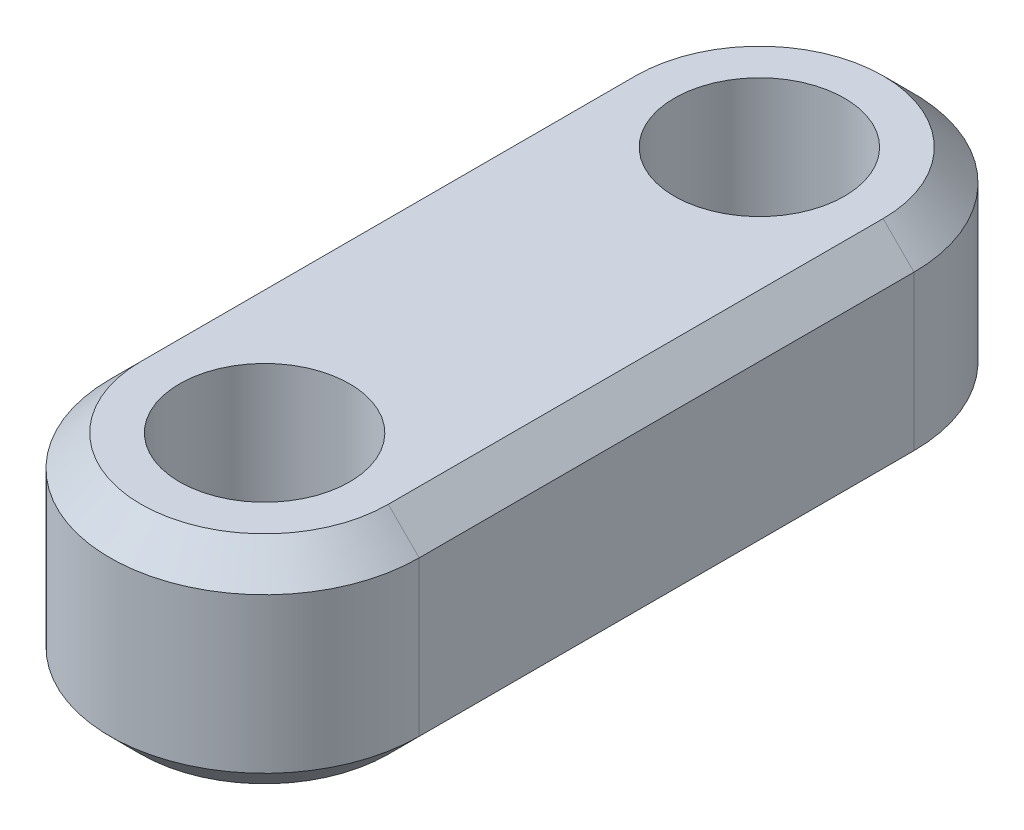
ISO-10303-21;
HEADER;
FILE_DESCRIPTION(('STEP AP214'),'2;1');
FILE_NAME('part.step','',(''),(''),'','','');
FILE_SCHEMA(('AUTOMOTIVE_DESIGN { 1 0 10303 214 1 1 1 1 }'));
ENDSEC;
DATA;
#1=APPLICATION_CONTEXT('core data for automotive mechanical design processes');
#2=APPLICATION_PROTOCOL_DEFINITION('international standard','automotive_design',2000,#1);
#3=PRODUCT_CONTEXT('',#1,'mechanical');
#4=PRODUCT('Part','Part','',(#3));
#5=PRODUCT_RELATED_PRODUCT_CATEGORY('part','',(#4));
#6=PRODUCT_DEFINITION_FORMATION('','',#4);
#7=PRODUCT_DEFINITION_CONTEXT('part definition',#1,'design');
#8=PRODUCT_DEFINITION('design','',#6,#7);
#9=PRODUCT_DEFINITION_SHAPE('','',#8);
#10=(LENGTH_UNIT() NAMED_UNIT(*) SI_UNIT(.MILLI.,.METRE.));
#11=(NAMED_UNIT(*) PLANE_ANGLE_UNIT() SI_UNIT($,.RADIAN.));
#12=(NAMED_UNIT(*) SI_UNIT($,.STERADIAN.) SOLID_ANGLE_UNIT());
#13=UNCERTAINTY_MEASURE_WITH_UNIT(LENGTH_MEASURE(1.E-05),#10,'distance_accuracy_value','');
#14=(GEOMETRIC_REPRESENTATION_CONTEXT(3) GLOBAL_UNCERTAINTY_ASSIGNED_CONTEXT((#13)) GLOBAL_UNIT_ASSIGNED_CONTEXT((#10,
#11,#12)) REPRESENTATION_CONTEXT('',''));
#15=CARTESIAN_POINT('',(0.,0.,0.));
#16=DIRECTION('',(0.,0.,1.));
#17=DIRECTION('',(1.,0.,0.));
#18=AXIS2_PLACEMENT_3D('',#15,#16,#17);
#19=CARTESIAN_POINT('',(0.,7.,16.));
#20=DIRECTION('',(0.,1.,0.));
#21=DIRECTION('',(0.,0.,1.));
#22=AXIS2_PLACEMENT_3D('',#19,#20,#21);
#23=PLANE('',#22);
#24=DIRECTION('',(0.,0.,1.));
#25=VECTOR('',#24,1.);
#26=CARTESIAN_POINT('',(-4.,7.,16.));
#27=LINE('',#26,#25);
#28=CARTESIAN_POINT('',(-3.99999999999998,7.,0.));
#29=VERTEX_POINT('',#28);
#30=CARTESIAN_POINT('',(-4.,7.,16.));
#31=VERTEX_POINT('',#30);
#32=EDGE_CURVE('E48',#29,#31,#27,.T.);
#33=ORIENTED_EDGE('',*,*,#32,.T.);
#34=CARTESIAN_POINT('',(0.,7.,16.));
#35=DIRECTION('',(0.,1.,0.));
#36=DIRECTION('',(0.,0.,1.));
#37=AXIS2_PLACEMENT_3D('',#34,#35,#36);
#38=CIRCLE('',#37,4.);
#39=CARTESIAN_POINT('',(4.00000000000001,7.,16.));
#40=VERTEX_POINT('',#39);
#41=EDGE_CURVE('E11',#31,#40,#38,.T.);
#42=ORIENTED_EDGE('',*,*,#41,.T.);
#43=DIRECTION('',(0.,0.,-1.));
#44=VECTOR('',#43,1.);
#45=CARTESIAN_POINT('',(3.99999999999995,7.,0.));
#46=LINE('',#45,#44);
#47=CARTESIAN_POINT('',(3.99999999999995,7.,0.));
#48=VERTEX_POINT('',#47);
#49=EDGE_CURVE('E156',#40,#48,#46,.T.);
#50=ORIENTED_EDGE('',*,*,#49,.T.);
#51=CARTESIAN_POINT('',(0.,7.,0.));
#52=DIRECTION('',(0.,1.,0.));
#53=DIRECTION('',(0.,0.,1.));
#54=AXIS2_PLACEMENT_3D('',#51,#52,#53);
#55=CIRCLE('',#54,3.99999999999998);
#56=EDGE_CURVE('E59',#48,#29,#55,.T.);
#57=ORIENTED_EDGE('',*,*,#56,.T.);
#58=EDGE_LOOP('',(#33,#42,#50,#57));
#59=FACE_BOUND('',#58,.T.);
#60=CARTESIAN_POINT('',(0.,7.,0.));
#61=DIRECTION('',(0.,1.,0.));
#62=DIRECTION('',(0.,0.,1.));
#63=AXIS2_PLACEMENT_3D('',#60,#61,#62);
#64=CIRCLE('',#63,2.75);
#65=CARTESIAN_POINT('',(0.,7.,2.75));
#66=VERTEX_POINT('',#65);
#67=EDGE_CURVE('E180',#66,#66,#64,.T.);
#68=ORIENTED_EDGE('',*,*,#67,.F.);
#69=EDGE_LOOP('',(#68));
#70=FACE_BOUND('',#69,.T.);
#71=CARTESIAN_POINT('',(0.,7.,16.));
#72=DIRECTION('',(0.,1.,0.));
#73=DIRECTION('',(0.,0.,1.));
#74=AXIS2_PLACEMENT_3D('',#71,#72,#73);
#75=CIRCLE('',#74,2.75);
#76=CARTESIAN_POINT('',(0.,7.,18.75));
#77=VERTEX_POINT('',#76);
#78=EDGE_CURVE('E184',#77,#77,#75,.T.);
#79=ORIENTED_EDGE('',*,*,#78,.F.);
#80=EDGE_LOOP('',(#79));
#81=FACE_BOUND('',#80,.T.);
#82=ADVANCED_FACE('F38',(#59,#70,#81),#23,.T.);
#83=CARTESIAN_POINT('',(0.,0.,16.));
#84=DIRECTION('',(0.,1.,0.));
#85=DIRECTION('',(0.,0.,1.));
#86=AXIS2_PLACEMENT_3D('',#83,#84,#85);
#87=PLANE('',#86);
#88=DIRECTION('',(0.,0.,-1.));
#89=VECTOR('',#88,1.);
#90=CARTESIAN_POINT('',(-4.,0.,16.));
#91=LINE('',#90,#89);
#92=CARTESIAN_POINT('',(-4.,0.,16.));
#93=VERTEX_POINT('',#92);
#94=CARTESIAN_POINT('',(-4.,0.,0.));
#95=VERTEX_POINT('',#94);
#96=EDGE_CURVE('E169',#93,#95,#91,.T.);
#97=ORIENTED_EDGE('',*,*,#96,.T.);
#98=CARTESIAN_POINT('',(0.,0.,0.));
#99=DIRECTION('',(0.,1.,0.));
#100=DIRECTION('',(0.,0.,1.));
#101=AXIS2_PLACEMENT_3D('',#98,#99,#100);
#102=CIRCLE('',#101,3.99999999999997);
#103=CARTESIAN_POINT('',(3.99999999999995,0.,0.));
#104=VERTEX_POINT('',#103);
#105=EDGE_CURVE('E115',#95,#104,#102,.F.);
#106=ORIENTED_EDGE('',*,*,#105,.T.);
#107=DIRECTION('',(0.,0.,1.));
#108=VECTOR('',#107,1.);
#109=CARTESIAN_POINT('',(4.,0.,16.));
#110=LINE('',#109,#108);
#111=CARTESIAN_POINT('',(4.,0.,16.));
#112=VERTEX_POINT('',#111);
#113=EDGE_CURVE('E173',#104,#112,#110,.T.);
#114=ORIENTED_EDGE('',*,*,#113,.T.);
#115=CARTESIAN_POINT('',(0.,0.,16.));
#116=DIRECTION('',(0.,1.,0.));
#117=DIRECTION('',(0.,0.,1.));
#118=AXIS2_PLACEMENT_3D('',#115,#116,#117);
#119=CIRCLE('',#118,4.);
#120=EDGE_CURVE('E171',#112,#93,#119,.F.);
#121=ORIENTED_EDGE('',*,*,#120,.T.);
#122=EDGE_LOOP('',(#97,#106,#114,#121));
#123=FACE_BOUND('',#122,.T.);
#124=CARTESIAN_POINT('',(0.,0.,0.));
#125=DIRECTION('',(0.,1.,0.));
#126=DIRECTION('',(0.,0.,1.));
#127=AXIS2_PLACEMENT_3D('',#124,#125,#126);
#128=CIRCLE('',#127,2.75);
#129=CARTESIAN_POINT('',(0.,0.,2.75));
#130=VERTEX_POINT('',#129);
#131=EDGE_CURVE('E181',#130,#130,#128,.T.);
#132=ORIENTED_EDGE('',*,*,#131,.T.);
#133=EDGE_LOOP('',(#132));
#134=FACE_BOUND('',#133,.T.);
#135=CARTESIAN_POINT('',(0.,0.,16.));
#136=DIRECTION('',(0.,1.,0.));
#137=DIRECTION('',(0.,0.,1.));
#138=AXIS2_PLACEMENT_3D('',#135,#136,#137);
#139=CIRCLE('',#138,2.75);
#140=CARTESIAN_POINT('',(0.,0.,18.75));
#141=VERTEX_POINT('',#140);
#142=EDGE_CURVE('E149',#141,#141,#139,.T.);
#143=ORIENTED_EDGE('',*,*,#142,.T.);
#144=EDGE_LOOP('',(#143));
#145=FACE_BOUND('',#144,.T.);
#146=ADVANCED_FACE('F196',(#123,#134,#145),#87,.F.);
#147=CARTESIAN_POINT('',(0.,7.,16.));
#148=DIRECTION('',(0.,-1.,0.));
#149=DIRECTION('',(0.,0.,-1.));
#150=AXIS2_PLACEMENT_3D('',#147,#148,#149);
#151=CYLINDRICAL_SURFACE('',#150,5.);
#152=DIRECTION('',(0.,-1.,0.));
#153=VECTOR('',#152,1.);
#154=CARTESIAN_POINT('',(-5.,7.,16.));
#155=LINE('',#154,#153);
#156=CARTESIAN_POINT('',(-5.,6.,16.));
#157=VERTEX_POINT('',#156);
#158=CARTESIAN_POINT('',(-5.,0.999999999999997,16.));
#159=VERTEX_POINT('',#158);
#160=EDGE_CURVE('E110',#157,#159,#155,.T.);
#161=ORIENTED_EDGE('',*,*,#160,.T.);
#162=CARTESIAN_POINT('',(0.,0.999999999999997,16.));
#163=DIRECTION('',(0.,1.,0.));
#164=DIRECTION('',(0.,0.,1.));
#165=AXIS2_PLACEMENT_3D('',#162,#163,#164);
#166=CIRCLE('',#165,5.);
#167=CARTESIAN_POINT('',(5.,0.999999999999997,16.));
#168=VERTEX_POINT('',#167);
#169=EDGE_CURVE('E162',#159,#168,#166,.T.);
#170=ORIENTED_EDGE('',*,*,#169,.T.);
#171=DIRECTION('',(0.,-1.,0.));
#172=VECTOR('',#171,1.);
#173=CARTESIAN_POINT('',(5.,7.,16.));
#174=LINE('',#173,#172);
#175=CARTESIAN_POINT('',(5.,6.,16.));
#176=VERTEX_POINT('',#175);
#177=EDGE_CURVE('E133',#176,#168,#174,.T.);
#178=ORIENTED_EDGE('',*,*,#177,.F.);
#179=CARTESIAN_POINT('',(0.,6.,16.));
#180=DIRECTION('',(0.,1.,0.));
#181=DIRECTION('',(0.,0.,1.));
#182=AXIS2_PLACEMENT_3D('',#179,#180,#181);
#183=CIRCLE('',#182,5.);
#184=EDGE_CURVE('E164',#176,#157,#183,.F.);
#185=ORIENTED_EDGE('',*,*,#184,.T.);
#186=EDGE_LOOP('',(#161,#170,#178,#185));
#187=FACE_BOUND('',#186,.T.);
#188=ADVANCED_FACE('F201',(#187),#151,.T.);
#189=CARTESIAN_POINT('',(5.,7.,16.));
#190=DIRECTION('',(-1.,0.,0.));
#191=DIRECTION('',(0.,0.,1.));
#192=AXIS2_PLACEMENT_3D('',#189,#190,#191);
#193=PLANE('',#192);
#194=ORIENTED_EDGE('',*,*,#177,.T.);
#195=DIRECTION('',(0.,0.,-1.));
#196=VECTOR('',#195,1.);
#197=CARTESIAN_POINT('',(5.,0.999999999999997,16.));
#198=LINE('',#197,#196);
#199=CARTESIAN_POINT('',(4.99999999999997,0.999999999999997,0.));
#200=VERTEX_POINT('',#199);
#201=EDGE_CURVE('E158',#168,#200,#198,.T.);
#202=ORIENTED_EDGE('',*,*,#201,.T.);
#203=DIRECTION('',(0.,-1.,0.));
#204=VECTOR('',#203,1.);
#205=CARTESIAN_POINT('',(4.99999999999997,7.,0.));
#206=LINE('',#205,#204);
#207=CARTESIAN_POINT('',(4.99999999999997,6.,0.));
#208=VERTEX_POINT('',#207);
#209=EDGE_CURVE('E126',#208,#200,#206,.T.);
#210=ORIENTED_EDGE('',*,*,#209,.F.);
#211=DIRECTION('',(0.,0.,1.));
#212=VECTOR('',#211,1.);
#213=CARTESIAN_POINT('',(5.,6.,16.));
#214=LINE('',#213,#212);
#215=EDGE_CURVE('E160',#208,#176,#214,.T.);
#216=ORIENTED_EDGE('',*,*,#215,.T.);
#217=EDGE_LOOP('',(#194,#202,#210,#216));
#218=FACE_BOUND('',#217,.T.);
#219=ADVANCED_FACE('F213',(#218),#193,.F.);
#220=CARTESIAN_POINT('',(0.,7.,0.));
#221=DIRECTION('',(0.,-1.,0.));
#222=DIRECTION('',(0.,0.,-1.));
#223=AXIS2_PLACEMENT_3D('',#220,#221,#222);
#224=CYLINDRICAL_SURFACE('',#223,4.99999999999997);
#225=ORIENTED_EDGE('',*,*,#209,.T.);
#226=CARTESIAN_POINT('',(0.,0.999999999999997,0.));
#227=DIRECTION('',(0.,1.,0.));
#228=DIRECTION('',(0.,0.,1.));
#229=AXIS2_PLACEMENT_3D('',#226,#227,#228);
#230=CIRCLE('',#229,4.99999999999997);
#231=CARTESIAN_POINT('',(-5.,0.999999999999997,0.));
#232=VERTEX_POINT('',#231);
#233=EDGE_CURVE('E125',#200,#232,#230,.T.);
#234=ORIENTED_EDGE('',*,*,#233,.T.);
#235=DIRECTION('',(0.,-1.,0.));
#236=VECTOR('',#235,1.);
#237=CARTESIAN_POINT('',(-5.,7.,0.));
#238=LINE('',#237,#236);
#239=CARTESIAN_POINT('',(-5.,6.,0.));
#240=VERTEX_POINT('',#239);
#241=EDGE_CURVE('E108',#240,#232,#238,.T.);
#242=ORIENTED_EDGE('',*,*,#241,.F.);
#243=CARTESIAN_POINT('',(0.,6.,0.));
#244=DIRECTION('',(0.,1.,0.));
#245=DIRECTION('',(0.,0.,1.));
#246=AXIS2_PLACEMENT_3D('',#243,#244,#245);
#247=CIRCLE('',#246,4.99999999999997);
#248=EDGE_CURVE('E122',#240,#208,#247,.F.);
#249=ORIENTED_EDGE('',*,*,#248,.T.);
#250=EDGE_LOOP('',(#225,#234,#242,#249));
#251=FACE_BOUND('',#250,.T.);
#252=ADVANCED_FACE('F121',(#251),#224,.T.);
#253=CARTESIAN_POINT('',(-5.,7.,16.));
#254=DIRECTION('',(1.,0.,0.));
#255=DIRECTION('',(0.,0.,-1.));
#256=AXIS2_PLACEMENT_3D('',#253,#254,#255);
#257=PLANE('',#256);
#258=ORIENTED_EDGE('',*,*,#241,.T.);
#259=DIRECTION('',(0.,0.,1.));
#260=VECTOR('',#259,1.);
#261=CARTESIAN_POINT('',(-5.,0.999999999999997,16.));
#262=LINE('',#261,#260);
#263=EDGE_CURVE('E114',#232,#159,#262,.T.);
#264=ORIENTED_EDGE('',*,*,#263,.T.);
#265=ORIENTED_EDGE('',*,*,#160,.F.);
#266=DIRECTION('',(0.,0.,-1.));
#267=VECTOR('',#266,1.);
#268=CARTESIAN_POINT('',(-5.,6.,0.));
#269=LINE('',#268,#267);
#270=EDGE_CURVE('E105',#157,#240,#269,.T.);
#271=ORIENTED_EDGE('',*,*,#270,.T.);
#272=EDGE_LOOP('',(#258,#264,#265,#271));
#273=FACE_BOUND('',#272,.T.);
#274=ADVANCED_FACE('F107',(#273),#257,.F.);
#275=CARTESIAN_POINT('',(0.,7.,0.));
#276=DIRECTION('',(0.,-1.,0.));
#277=DIRECTION('',(0.,0.,-1.));
#278=AXIS2_PLACEMENT_3D('',#275,#276,#277);
#279=CYLINDRICAL_SURFACE('',#278,2.75);
#280=ORIENTED_EDGE('',*,*,#67,.T.);
#281=EDGE_LOOP('',(#280));
#282=FACE_BOUND('',#281,.T.);
#283=ORIENTED_EDGE('',*,*,#131,.F.);
#284=EDGE_LOOP('',(#283));
#285=FACE_BOUND('',#284,.T.);
#286=ADVANCED_FACE('F206',(#282,#285),#279,.F.);
#287=CARTESIAN_POINT('',(0.,7.,16.));
#288=DIRECTION('',(0.,-1.,0.));
#289=DIRECTION('',(0.,0.,-1.));
#290=AXIS2_PLACEMENT_3D('',#287,#288,#289);
#291=CYLINDRICAL_SURFACE('',#290,2.75);
#292=ORIENTED_EDGE('',*,*,#78,.T.);
#293=EDGE_LOOP('',(#292));
#294=FACE_BOUND('',#293,.T.);
#295=ORIENTED_EDGE('',*,*,#142,.F.);
#296=EDGE_LOOP('',(#295));
#297=FACE_BOUND('',#296,.T.);
#298=ADVANCED_FACE('F192',(#294,#297),#291,.F.);
#299=CARTESIAN_POINT('',(0.,0.999999999999997,16.));
#300=DIRECTION('',(0.,1.,0.));
#301=DIRECTION('',(0.,0.,1.));
#302=AXIS2_PLACEMENT_3D('',#299,#300,#301);
#303=CONICAL_SURFACE('',#302,5.,0.78539816339745);
#304=DIRECTION('',(-0.707106781186549,0.707106781186546,0.));
#305=VECTOR('',#304,1.);
#306=CARTESIAN_POINT('',(-4.,0.,16.));
#307=LINE('',#306,#305);
#308=EDGE_CURVE('E150',#93,#159,#307,.T.);
#309=ORIENTED_EDGE('',*,*,#308,.F.);
#310=ORIENTED_EDGE('',*,*,#120,.F.);
#311=DIRECTION('',(-0.707106781186549,-0.707106781186546,0.));
#312=VECTOR('',#311,1.);
#313=CARTESIAN_POINT('',(5.,0.999999999999997,16.));
#314=LINE('',#313,#312);
#315=EDGE_CURVE('E146',#168,#112,#314,.T.);
#316=ORIENTED_EDGE('',*,*,#315,.F.);
#317=ORIENTED_EDGE('',*,*,#169,.F.);
#318=EDGE_LOOP('',(#309,#310,#316,#317));
#319=FACE_BOUND('',#318,.T.);
#320=ADVANCED_FACE('F241',(#319),#303,.T.);
#321=CARTESIAN_POINT('',(5.,0.999999999999997,16.));
#322=DIRECTION('',(-0.707106781186546,0.707106781186549,0.));
#323=DIRECTION('',(0.,0.,-1.));
#324=AXIS2_PLACEMENT_3D('',#321,#322,#323);
#325=PLANE('',#324);
#326=ORIENTED_EDGE('',*,*,#315,.T.);
#327=ORIENTED_EDGE('',*,*,#113,.F.);
#328=DIRECTION('',(-0.707106781186549,-0.707106781186546,0.));
#329=VECTOR('',#328,1.);
#330=CARTESIAN_POINT('',(4.99999999999995,0.999999999999997,0.));
#331=LINE('',#330,#329);
#332=EDGE_CURVE('E137',#200,#104,#331,.T.);
#333=ORIENTED_EDGE('',*,*,#332,.F.);
#334=ORIENTED_EDGE('',*,*,#201,.F.);
#335=EDGE_LOOP('',(#326,#327,#333,#334));
#336=FACE_BOUND('',#335,.T.);
#337=ADVANCED_FACE('F234',(#336),#325,.F.);
#338=CARTESIAN_POINT('',(-5.,0.999999999999997,16.));
#339=DIRECTION('',(0.707106781186546,0.707106781186549,0.));
#340=DIRECTION('',(0.,0.,1.));
#341=AXIS2_PLACEMENT_3D('',#338,#339,#340);
#342=PLANE('',#341);
#343=ORIENTED_EDGE('',*,*,#308,.T.);
#344=ORIENTED_EDGE('',*,*,#263,.F.);
#345=DIRECTION('',(-0.707106781186549,0.707106781186546,0.));
#346=VECTOR('',#345,1.);
#347=CARTESIAN_POINT('',(-4.,0.,0.));
#348=LINE('',#347,#346);
#349=EDGE_CURVE('E136',#95,#232,#348,.T.);
#350=ORIENTED_EDGE('',*,*,#349,.F.);
#351=ORIENTED_EDGE('',*,*,#96,.F.);
#352=EDGE_LOOP('',(#343,#344,#350,#351));
#353=FACE_BOUND('',#352,.T.);
#354=ADVANCED_FACE('F227',(#353),#342,.F.);
#355=CARTESIAN_POINT('',(0.,0.999999999999997,0.));
#356=DIRECTION('',(0.,1.,0.));
#357=DIRECTION('',(0.,0.,1.));
#358=AXIS2_PLACEMENT_3D('',#355,#356,#357);
#359=CONICAL_SURFACE('',#358,4.99999999999997,0.78539816339745);
#360=ORIENTED_EDGE('',*,*,#332,.T.);
#361=ORIENTED_EDGE('',*,*,#105,.F.);
#362=ORIENTED_EDGE('',*,*,#349,.T.);
#363=ORIENTED_EDGE('',*,*,#233,.F.);
#364=EDGE_LOOP('',(#360,#361,#362,#363));
#365=FACE_BOUND('',#364,.T.);
#366=ADVANCED_FACE('F221',(#365),#359,.T.);
#367=CARTESIAN_POINT('',(0.,7.,0.));
#368=DIRECTION('',(0.,-1.,0.));
#369=DIRECTION('',(0.,0.,-1.));
#370=AXIS2_PLACEMENT_3D('',#367,#368,#369);
#371=CONICAL_SURFACE('',#370,3.99999999999998,0.785398163397445);
#372=DIRECTION('',(-0.707106781186545,0.70710678118655,0.));
#373=VECTOR('',#372,1.);
#374=CARTESIAN_POINT('',(4.99999999999997,6.,0.));
#375=LINE('',#374,#373);
#376=EDGE_CURVE('E131',#208,#48,#375,.T.);
#377=ORIENTED_EDGE('',*,*,#376,.F.);
#378=ORIENTED_EDGE('',*,*,#248,.F.);
#379=DIRECTION('',(-0.707106781186545,-0.70710678118655,0.));
#380=VECTOR('',#379,1.);
#381=CARTESIAN_POINT('',(-3.99999999999998,7.,0.));
#382=LINE('',#381,#380);
#383=EDGE_CURVE('E43',#29,#240,#382,.T.);
#384=ORIENTED_EDGE('',*,*,#383,.F.);
#385=ORIENTED_EDGE('',*,*,#56,.F.);
#386=EDGE_LOOP('',(#377,#378,#384,#385));
#387=FACE_BOUND('',#386,.T.);
#388=ADVANCED_FACE('F41',(#387),#371,.T.);
#389=CARTESIAN_POINT('',(-4.,7.,16.));
#390=DIRECTION('',(-0.70710678118655,0.707106781186545,0.));
#391=DIRECTION('',(0.,0.,-1.));
#392=AXIS2_PLACEMENT_3D('',#389,#390,#391);
#393=PLANE('',#392);
#394=ORIENTED_EDGE('',*,*,#383,.T.);
#395=ORIENTED_EDGE('',*,*,#270,.F.);
#396=DIRECTION('',(-0.707106781186545,-0.70710678118655,0.));
#397=VECTOR('',#396,1.);
#398=CARTESIAN_POINT('',(-4.,7.,16.));
#399=LINE('',#398,#397);
#400=EDGE_CURVE('E139',#31,#157,#399,.T.);
#401=ORIENTED_EDGE('',*,*,#400,.F.);
#402=ORIENTED_EDGE('',*,*,#32,.F.);
#403=EDGE_LOOP('',(#394,#395,#401,#402));
#404=FACE_BOUND('',#403,.T.);
#405=ADVANCED_FACE('F135',(#404),#393,.T.);
#406=CARTESIAN_POINT('',(4.00000000000001,7.,16.));
#407=DIRECTION('',(0.70710678118655,0.707106781186545,0.));
#408=DIRECTION('',(0.,0.,1.));
#409=AXIS2_PLACEMENT_3D('',#406,#407,#408);
#410=PLANE('',#409);
#411=ORIENTED_EDGE('',*,*,#376,.T.);
#412=ORIENTED_EDGE('',*,*,#49,.F.);
#413=DIRECTION('',(-0.707106781186545,0.70710678118655,0.));
#414=VECTOR('',#413,1.);
#415=CARTESIAN_POINT('',(5.,6.,16.));
#416=LINE('',#415,#414);
#417=EDGE_CURVE('E142',#176,#40,#416,.T.);
#418=ORIENTED_EDGE('',*,*,#417,.F.);
#419=ORIENTED_EDGE('',*,*,#215,.F.);
#420=EDGE_LOOP('',(#411,#412,#418,#419));
#421=FACE_BOUND('',#420,.T.);
#422=ADVANCED_FACE('F255',(#421),#410,.T.);
#423=CARTESIAN_POINT('',(0.,7.,16.));
#424=DIRECTION('',(0.,-1.,0.));
#425=DIRECTION('',(0.,0.,-1.));
#426=AXIS2_PLACEMENT_3D('',#423,#424,#425);
#427=CONICAL_SURFACE('',#426,4.,0.785398163397445);
#428=ORIENTED_EDGE('',*,*,#400,.T.);
#429=ORIENTED_EDGE('',*,*,#184,.F.);
#430=ORIENTED_EDGE('',*,*,#417,.T.);
#431=ORIENTED_EDGE('',*,*,#41,.F.);
#432=EDGE_LOOP('',(#428,#429,#430,#431));
#433=FACE_BOUND('',#432,.T.);
#434=ADVANCED_FACE('F249',(#433),#427,.T.);
#435=CLOSED_SHELL('',(#82,#146,#188,#219,#252,#274,#286,#298,#320,#337,#354,#366,#388,#405,#422,#434));
#436=MANIFOLD_SOLID_BREP('B2',#435);
#437=ADVANCED_BREP_SHAPE_REPRESENTATION('',(#18,#436),#14);
#438=SHAPE_DEFINITION_REPRESENTATION(#9,#437);
ENDSEC;
END-ISO-10303-21;
